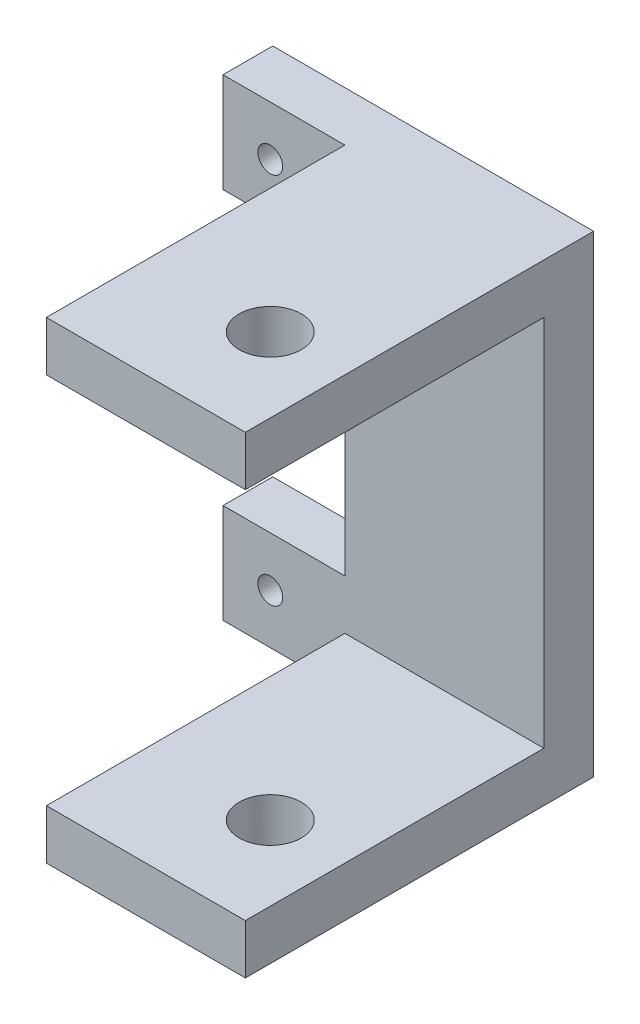
ISO-10303-21;
HEADER;
FILE_DESCRIPTION(('STEP AP214'),'2;1');
FILE_NAME('part.step','',(''),(''),'','','');
FILE_SCHEMA(('AUTOMOTIVE_DESIGN { 1 0 10303 214 1 1 1 1 }'));
ENDSEC;
DATA;
#1=APPLICATION_CONTEXT('core data for automotive mechanical design processes');
#2=APPLICATION_PROTOCOL_DEFINITION('international standard','automotive_design',2000,#1);
#3=PRODUCT_CONTEXT('',#1,'mechanical');
#4=PRODUCT('Part','Part','',(#3));
#5=PRODUCT_RELATED_PRODUCT_CATEGORY('part','',(#4));
#6=PRODUCT_DEFINITION_FORMATION('','',#4);
#7=PRODUCT_DEFINITION_CONTEXT('part definition',#1,'design');
#8=PRODUCT_DEFINITION('design','',#6,#7);
#9=PRODUCT_DEFINITION_SHAPE('','',#8);
#10=(LENGTH_UNIT() NAMED_UNIT(*) SI_UNIT(.MILLI.,.METRE.));
#11=(NAMED_UNIT(*) PLANE_ANGLE_UNIT() SI_UNIT($,.RADIAN.));
#12=(NAMED_UNIT(*) SI_UNIT($,.STERADIAN.) SOLID_ANGLE_UNIT());
#13=UNCERTAINTY_MEASURE_WITH_UNIT(LENGTH_MEASURE(1.E-05),#10,'distance_accuracy_value','');
#14=(GEOMETRIC_REPRESENTATION_CONTEXT(3) GLOBAL_UNCERTAINTY_ASSIGNED_CONTEXT((#13)) GLOBAL_UNIT_ASSIGNED_CONTEXT((#10,
#11,#12)) REPRESENTATION_CONTEXT('',''));
#15=CARTESIAN_POINT('',(0.,0.,0.));
#16=DIRECTION('',(0.,0.,1.));
#17=DIRECTION('',(1.,0.,0.));
#18=AXIS2_PLACEMENT_3D('',#15,#16,#17);
#19=CARTESIAN_POINT('',(0.,0.,2.));
#20=DIRECTION('',(0.,0.,1.));
#21=DIRECTION('',(1.,0.,0.));
#22=AXIS2_PLACEMENT_3D('',#19,#20,#21);
#23=PLANE('',#22);
#24=CARTESIAN_POINT('',(-3.,7.5,2.));
#25=DIRECTION('',(0.,0.,1.));
#26=DIRECTION('',(1.,0.,0.));
#27=AXIS2_PLACEMENT_3D('',#24,#25,#26);
#28=CIRCLE('',#27,0.5);
#29=CARTESIAN_POINT('',(-2.5,7.5,2.));
#30=VERTEX_POINT('',#29);
#31=EDGE_CURVE('E317',#30,#30,#28,.T.);
#32=ORIENTED_EDGE('',*,*,#31,.F.);
#33=EDGE_LOOP('',(#32));
#34=FACE_BOUND('',#33,.T.);
#35=CARTESIAN_POINT('',(-3.,-7.5,2.));
#36=DIRECTION('',(0.,0.,1.));
#37=DIRECTION('',(1.,0.,0.));
#38=AXIS2_PLACEMENT_3D('',#35,#36,#37);
#39=CIRCLE('',#38,0.5);
#40=CARTESIAN_POINT('',(-2.5,-7.5,2.));
#41=VERTEX_POINT('',#40);
#42=EDGE_CURVE('E377',#41,#41,#39,.T.);
#43=ORIENTED_EDGE('',*,*,#42,.F.);
#44=EDGE_LOOP('',(#43));
#45=FACE_BOUND('',#44,.T.);
#46=DIRECTION('',(0.,-1.,0.));
#47=VECTOR('',#46,1.);
#48=CARTESIAN_POINT('',(0.,-7.5,2.));
#49=LINE('',#48,#47);
#50=CARTESIAN_POINT('',(0.,-7.5,2.));
#51=VERTEX_POINT('',#50);
#52=CARTESIAN_POINT('',(0.,-9.5,2.));
#53=VERTEX_POINT('',#52);
#54=EDGE_CURVE('E49',#51,#53,#49,.T.);
#55=ORIENTED_EDGE('',*,*,#54,.F.);
#56=DIRECTION('',(-1.,0.,0.));
#57=VECTOR('',#56,1.);
#58=CARTESIAN_POINT('',(0.,-7.5,2.));
#59=LINE('',#58,#57);
#60=CARTESIAN_POINT('',(8.,-7.5,2.));
#61=VERTEX_POINT('',#60);
#62=EDGE_CURVE('E53',#61,#51,#59,.T.);
#63=ORIENTED_EDGE('',*,*,#62,.F.);
#64=DIRECTION('',(0.,1.,0.));
#65=VECTOR('',#64,1.);
#66=CARTESIAN_POINT('',(8.,9.5,2.));
#67=LINE('',#66,#65);
#68=CARTESIAN_POINT('',(8.,7.5,2.));
#69=VERTEX_POINT('',#68);
#70=EDGE_CURVE('E155',#61,#69,#67,.T.);
#71=ORIENTED_EDGE('',*,*,#70,.T.);
#72=DIRECTION('',(1.,0.,0.));
#73=VECTOR('',#72,1.);
#74=CARTESIAN_POINT('',(0.,7.5,2.));
#75=LINE('',#74,#73);
#76=CARTESIAN_POINT('',(0.,7.5,2.));
#77=VERTEX_POINT('',#76);
#78=EDGE_CURVE('E159',#77,#69,#75,.T.);
#79=ORIENTED_EDGE('',*,*,#78,.F.);
#80=DIRECTION('',(0.,-1.,0.));
#81=VECTOR('',#80,1.);
#82=CARTESIAN_POINT('',(0.,9.5,2.));
#83=LINE('',#82,#81);
#84=CARTESIAN_POINT('',(0.,9.5,2.));
#85=VERTEX_POINT('',#84);
#86=EDGE_CURVE('E156',#85,#77,#83,.T.);
#87=ORIENTED_EDGE('',*,*,#86,.F.);
#88=DIRECTION('',(-1.,0.,0.));
#89=VECTOR('',#88,1.);
#90=CARTESIAN_POINT('',(-4.9,9.5,2.));
#91=LINE('',#90,#89);
#92=CARTESIAN_POINT('',(-4.9,9.5,2.));
#93=VERTEX_POINT('',#92);
#94=EDGE_CURVE('E187',#85,#93,#91,.T.);
#95=ORIENTED_EDGE('',*,*,#94,.T.);
#96=DIRECTION('',(0.,-1.,0.));
#97=VECTOR('',#96,1.);
#98=CARTESIAN_POINT('',(-4.9,9.5,2.));
#99=LINE('',#98,#97);
#100=CARTESIAN_POINT('',(-4.9,5.5,2.));
#101=VERTEX_POINT('',#100);
#102=EDGE_CURVE('E190',#93,#101,#99,.T.);
#103=ORIENTED_EDGE('',*,*,#102,.T.);
#104=DIRECTION('',(1.,0.,0.));
#105=VECTOR('',#104,1.);
#106=CARTESIAN_POINT('',(-4.9,5.5,2.));
#107=LINE('',#106,#105);
#108=CARTESIAN_POINT('',(0.,5.5,2.));
#109=VERTEX_POINT('',#108);
#110=EDGE_CURVE('E192',#101,#109,#107,.T.);
#111=ORIENTED_EDGE('',*,*,#110,.T.);
#112=DIRECTION('',(0.,-1.,0.));
#113=VECTOR('',#112,1.);
#114=CARTESIAN_POINT('',(0.,5.5,2.));
#115=LINE('',#114,#113);
#116=CARTESIAN_POINT('',(0.,-5.5,2.));
#117=VERTEX_POINT('',#116);
#118=EDGE_CURVE('E194',#109,#117,#115,.T.);
#119=ORIENTED_EDGE('',*,*,#118,.T.);
#120=DIRECTION('',(-1.,0.,0.));
#121=VECTOR('',#120,1.);
#122=CARTESIAN_POINT('',(-4.9,-5.5,2.));
#123=LINE('',#122,#121);
#124=CARTESIAN_POINT('',(-4.9,-5.5,2.));
#125=VERTEX_POINT('',#124);
#126=EDGE_CURVE('E196',#117,#125,#123,.T.);
#127=ORIENTED_EDGE('',*,*,#126,.T.);
#128=DIRECTION('',(0.,-1.,0.));
#129=VECTOR('',#128,1.);
#130=CARTESIAN_POINT('',(-4.9,-5.5,2.));
#131=LINE('',#130,#129);
#132=CARTESIAN_POINT('',(-4.89999999999999,-9.5,2.));
#133=VERTEX_POINT('',#132);
#134=EDGE_CURVE('E198',#125,#133,#131,.T.);
#135=ORIENTED_EDGE('',*,*,#134,.T.);
#136=DIRECTION('',(1.,0.,0.));
#137=VECTOR('',#136,1.);
#138=CARTESIAN_POINT('',(-4.89999999999999,-9.5,2.));
#139=LINE('',#138,#137);
#140=EDGE_CURVE('E200',#133,#53,#139,.T.);
#141=ORIENTED_EDGE('',*,*,#140,.T.);
#142=EDGE_LOOP('',(#55,#63,#71,#79,#87,#95,#103,#111,#119,#127,#135,#141));
#143=FACE_BOUND('',#142,.T.);
#144=ADVANCED_FACE('F33',(#34,#45,#143),#23,.T.);
#145=CARTESIAN_POINT('',(8.,9.5,2.));
#146=DIRECTION('',(-1.,0.,0.));
#147=DIRECTION('',(0.,-1.,0.));
#148=AXIS2_PLACEMENT_3D('',#145,#146,#147);
#149=PLANE('',#148);
#150=DIRECTION('',(0.,1.,0.));
#151=VECTOR('',#150,1.);
#152=CARTESIAN_POINT('',(8.,9.5,0.));
#153=LINE('',#152,#151);
#154=CARTESIAN_POINT('',(8.,-9.5,0.));
#155=VERTEX_POINT('',#154);
#156=CARTESIAN_POINT('',(8.,9.5,0.));
#157=VERTEX_POINT('',#156);
#158=EDGE_CURVE('E185',#155,#157,#153,.T.);
#159=ORIENTED_EDGE('',*,*,#158,.T.);
#160=DIRECTION('',(0.,0.,-1.));
#161=VECTOR('',#160,1.);
#162=CARTESIAN_POINT('',(8.,9.5,2.));
#163=LINE('',#162,#161);
#164=CARTESIAN_POINT('',(8.,9.5,14.));
#165=VERTEX_POINT('',#164);
#166=EDGE_CURVE('E11',#165,#157,#163,.T.);
#167=ORIENTED_EDGE('',*,*,#166,.F.);
#168=DIRECTION('',(0.,1.,0.));
#169=VECTOR('',#168,1.);
#170=CARTESIAN_POINT('',(8.,9.5,14.));
#171=LINE('',#170,#169);
#172=CARTESIAN_POINT('',(8.,7.5,14.));
#173=VERTEX_POINT('',#172);
#174=EDGE_CURVE('E170',#173,#165,#171,.T.);
#175=ORIENTED_EDGE('',*,*,#174,.F.);
#176=DIRECTION('',(0.,0.,-1.));
#177=VECTOR('',#176,1.);
#178=CARTESIAN_POINT('',(8.,7.5,14.));
#179=LINE('',#178,#177);
#180=EDGE_CURVE('E180',#173,#69,#179,.T.);
#181=ORIENTED_EDGE('',*,*,#180,.T.);
#182=ORIENTED_EDGE('',*,*,#70,.F.);
#183=DIRECTION('',(0.,0.,-1.));
#184=VECTOR('',#183,1.);
#185=CARTESIAN_POINT('',(8.,-7.5,14.));
#186=LINE('',#185,#184);
#187=CARTESIAN_POINT('',(8.,-7.5,14.));
#188=VERTEX_POINT('',#187);
#189=EDGE_CURVE('E137',#188,#61,#186,.T.);
#190=ORIENTED_EDGE('',*,*,#189,.F.);
#191=DIRECTION('',(0.,1.,0.));
#192=VECTOR('',#191,1.);
#193=CARTESIAN_POINT('',(8.,-7.5,14.));
#194=LINE('',#193,#192);
#195=CARTESIAN_POINT('',(8.,-9.5,14.));
#196=VERTEX_POINT('',#195);
#197=EDGE_CURVE('E143',#196,#188,#194,.T.);
#198=ORIENTED_EDGE('',*,*,#197,.F.);
#199=DIRECTION('',(0.,0.,-1.));
#200=VECTOR('',#199,1.);
#201=CARTESIAN_POINT('',(8.,-9.5,2.));
#202=LINE('',#201,#200);
#203=EDGE_CURVE('E202',#196,#155,#202,.T.);
#204=ORIENTED_EDGE('',*,*,#203,.T.);
#205=EDGE_LOOP('',(#159,#167,#175,#181,#182,#190,#198,#204));
#206=FACE_BOUND('',#205,.T.);
#207=ADVANCED_FACE('F35',(#206),#149,.F.);
#208=CARTESIAN_POINT('',(-4.9,9.5,2.));
#209=DIRECTION('',(0.,-1.,0.));
#210=DIRECTION('',(0.,0.,-1.));
#211=AXIS2_PLACEMENT_3D('',#208,#209,#210);
#212=PLANE('',#211);
#213=CARTESIAN_POINT('',(5.,9.5,10.));
#214=DIRECTION('',(0.,-1.,0.));
#215=DIRECTION('',(0.,0.,-1.));
#216=AXIS2_PLACEMENT_3D('',#213,#214,#215);
#217=CIRCLE('',#216,1.25);
#218=CARTESIAN_POINT('',(5.,9.5,8.75));
#219=VERTEX_POINT('',#218);
#220=EDGE_CURVE('E311',#219,#219,#217,.T.);
#221=ORIENTED_EDGE('',*,*,#220,.T.);
#222=EDGE_LOOP('',(#221));
#223=FACE_BOUND('',#222,.T.);
#224=DIRECTION('',(-1.,0.,0.));
#225=VECTOR('',#224,1.);
#226=CARTESIAN_POINT('',(-4.9,9.5,0.));
#227=LINE('',#226,#225);
#228=CARTESIAN_POINT('',(-4.9,9.5,0.));
#229=VERTEX_POINT('',#228);
#230=EDGE_CURVE('E204',#157,#229,#227,.T.);
#231=ORIENTED_EDGE('',*,*,#230,.T.);
#232=DIRECTION('',(0.,0.,-1.));
#233=VECTOR('',#232,1.);
#234=CARTESIAN_POINT('',(-4.9,9.5,2.));
#235=LINE('',#234,#233);
#236=EDGE_CURVE('E42',#93,#229,#235,.T.);
#237=ORIENTED_EDGE('',*,*,#236,.F.);
#238=ORIENTED_EDGE('',*,*,#94,.F.);
#239=DIRECTION('',(0.,0.,-1.));
#240=VECTOR('',#239,1.);
#241=CARTESIAN_POINT('',(0.,9.5,14.));
#242=LINE('',#241,#240);
#243=CARTESIAN_POINT('',(0.,9.5,14.));
#244=VERTEX_POINT('',#243);
#245=EDGE_CURVE('E174',#244,#85,#242,.T.);
#246=ORIENTED_EDGE('',*,*,#245,.F.);
#247=DIRECTION('',(-1.,0.,0.));
#248=VECTOR('',#247,1.);
#249=CARTESIAN_POINT('',(0.,9.5,14.));
#250=LINE('',#249,#248);
#251=EDGE_CURVE('E173',#165,#244,#250,.T.);
#252=ORIENTED_EDGE('',*,*,#251,.F.);
#253=ORIENTED_EDGE('',*,*,#166,.T.);
#254=EDGE_LOOP('',(#231,#237,#238,#246,#252,#253));
#255=FACE_BOUND('',#254,.T.);
#256=ADVANCED_FACE('F259',(#223,#255),#212,.F.);
#257=CARTESIAN_POINT('',(-4.9,9.5,2.));
#258=DIRECTION('',(1.,0.,0.));
#259=DIRECTION('',(0.,1.,0.));
#260=AXIS2_PLACEMENT_3D('',#257,#258,#259);
#261=PLANE('',#260);
#262=DIRECTION('',(0.,-1.,0.));
#263=VECTOR('',#262,1.);
#264=CARTESIAN_POINT('',(-4.9,9.5,0.));
#265=LINE('',#264,#263);
#266=CARTESIAN_POINT('',(-4.9,5.5,0.));
#267=VERTEX_POINT('',#266);
#268=EDGE_CURVE('E206',#229,#267,#265,.T.);
#269=ORIENTED_EDGE('',*,*,#268,.T.);
#270=DIRECTION('',(0.,0.,-1.));
#271=VECTOR('',#270,1.);
#272=CARTESIAN_POINT('',(-4.9,5.5,2.));
#273=LINE('',#272,#271);
#274=EDGE_CURVE('E230',#101,#267,#273,.T.);
#275=ORIENTED_EDGE('',*,*,#274,.F.);
#276=ORIENTED_EDGE('',*,*,#102,.F.);
#277=ORIENTED_EDGE('',*,*,#236,.T.);
#278=EDGE_LOOP('',(#269,#275,#276,#277));
#279=FACE_BOUND('',#278,.T.);
#280=ADVANCED_FACE('F238',(#279),#261,.F.);
#281=CARTESIAN_POINT('',(-4.9,5.5,2.));
#282=DIRECTION('',(0.,1.,0.));
#283=DIRECTION('',(0.,0.,1.));
#284=AXIS2_PLACEMENT_3D('',#281,#282,#283);
#285=PLANE('',#284);
#286=DIRECTION('',(1.,0.,0.));
#287=VECTOR('',#286,1.);
#288=CARTESIAN_POINT('',(-4.9,5.5,0.));
#289=LINE('',#288,#287);
#290=CARTESIAN_POINT('',(0.,5.5,0.));
#291=VERTEX_POINT('',#290);
#292=EDGE_CURVE('E208',#267,#291,#289,.T.);
#293=ORIENTED_EDGE('',*,*,#292,.T.);
#294=DIRECTION('',(0.,0.,-1.));
#295=VECTOR('',#294,1.);
#296=CARTESIAN_POINT('',(0.,5.5,2.));
#297=LINE('',#296,#295);
#298=EDGE_CURVE('E227',#109,#291,#297,.T.);
#299=ORIENTED_EDGE('',*,*,#298,.F.);
#300=ORIENTED_EDGE('',*,*,#110,.F.);
#301=ORIENTED_EDGE('',*,*,#274,.T.);
#302=EDGE_LOOP('',(#293,#299,#300,#301));
#303=FACE_BOUND('',#302,.T.);
#304=ADVANCED_FACE('F250',(#303),#285,.F.);
#305=CARTESIAN_POINT('',(0.,5.5,2.));
#306=DIRECTION('',(1.,0.,0.));
#307=DIRECTION('',(0.,1.,0.));
#308=AXIS2_PLACEMENT_3D('',#305,#306,#307);
#309=PLANE('',#308);
#310=DIRECTION('',(0.,-1.,0.));
#311=VECTOR('',#310,1.);
#312=CARTESIAN_POINT('',(0.,5.5,0.));
#313=LINE('',#312,#311);
#314=CARTESIAN_POINT('',(0.,-5.5,0.));
#315=VERTEX_POINT('',#314);
#316=EDGE_CURVE('E210',#291,#315,#313,.T.);
#317=ORIENTED_EDGE('',*,*,#316,.T.);
#318=DIRECTION('',(0.,0.,-1.));
#319=VECTOR('',#318,1.);
#320=CARTESIAN_POINT('',(0.,-5.5,2.));
#321=LINE('',#320,#319);
#322=EDGE_CURVE('E224',#117,#315,#321,.T.);
#323=ORIENTED_EDGE('',*,*,#322,.F.);
#324=ORIENTED_EDGE('',*,*,#118,.F.);
#325=ORIENTED_EDGE('',*,*,#298,.T.);
#326=EDGE_LOOP('',(#317,#323,#324,#325));
#327=FACE_BOUND('',#326,.T.);
#328=ADVANCED_FACE('F254',(#327),#309,.F.);
#329=CARTESIAN_POINT('',(-4.9,-5.5,2.));
#330=DIRECTION('',(0.,-1.,0.));
#331=DIRECTION('',(0.,0.,-1.));
#332=AXIS2_PLACEMENT_3D('',#329,#330,#331);
#333=PLANE('',#332);
#334=DIRECTION('',(-1.,0.,0.));
#335=VECTOR('',#334,1.);
#336=CARTESIAN_POINT('',(-4.9,-5.5,0.));
#337=LINE('',#336,#335);
#338=CARTESIAN_POINT('',(-4.9,-5.5,0.));
#339=VERTEX_POINT('',#338);
#340=EDGE_CURVE('E212',#315,#339,#337,.T.);
#341=ORIENTED_EDGE('',*,*,#340,.T.);
#342=DIRECTION('',(0.,0.,-1.));
#343=VECTOR('',#342,1.);
#344=CARTESIAN_POINT('',(-4.9,-5.5,2.));
#345=LINE('',#344,#343);
#346=EDGE_CURVE('E221',#125,#339,#345,.T.);
#347=ORIENTED_EDGE('',*,*,#346,.F.);
#348=ORIENTED_EDGE('',*,*,#126,.F.);
#349=ORIENTED_EDGE('',*,*,#322,.T.);
#350=EDGE_LOOP('',(#341,#347,#348,#349));
#351=FACE_BOUND('',#350,.T.);
#352=ADVANCED_FACE('F280',(#351),#333,.F.);
#353=CARTESIAN_POINT('',(-4.9,-5.5,2.));
#354=DIRECTION('',(1.,0.,0.));
#355=DIRECTION('',(0.,1.,0.));
#356=AXIS2_PLACEMENT_3D('',#353,#354,#355);
#357=PLANE('',#356);
#358=DIRECTION('',(0.,-1.,0.));
#359=VECTOR('',#358,1.);
#360=CARTESIAN_POINT('',(-4.9,-5.5,0.));
#361=LINE('',#360,#359);
#362=CARTESIAN_POINT('',(-4.89999999999999,-9.5,0.));
#363=VERTEX_POINT('',#362);
#364=EDGE_CURVE('E214',#339,#363,#361,.T.);
#365=ORIENTED_EDGE('',*,*,#364,.T.);
#366=DIRECTION('',(0.,0.,-1.));
#367=VECTOR('',#366,1.);
#368=CARTESIAN_POINT('',(-4.89999999999999,-9.5,2.));
#369=LINE('',#368,#367);
#370=EDGE_CURVE('E218',#133,#363,#369,.T.);
#371=ORIENTED_EDGE('',*,*,#370,.F.);
#372=ORIENTED_EDGE('',*,*,#134,.F.);
#373=ORIENTED_EDGE('',*,*,#346,.T.);
#374=EDGE_LOOP('',(#365,#371,#372,#373));
#375=FACE_BOUND('',#374,.T.);
#376=ADVANCED_FACE('F278',(#375),#357,.F.);
#377=CARTESIAN_POINT('',(-4.89999999999999,-9.5,2.));
#378=DIRECTION('',(0.,1.,0.));
#379=DIRECTION('',(0.,0.,1.));
#380=AXIS2_PLACEMENT_3D('',#377,#378,#379);
#381=PLANE('',#380);
#382=CARTESIAN_POINT('',(5.,-9.5,10.));
#383=DIRECTION('',(0.,-1.,0.));
#384=DIRECTION('',(0.,0.,-1.));
#385=AXIS2_PLACEMENT_3D('',#382,#383,#384);
#386=CIRCLE('',#385,1.25);
#387=CARTESIAN_POINT('',(5.,-9.5,8.75));
#388=VERTEX_POINT('',#387);
#389=EDGE_CURVE('E309',#388,#388,#386,.T.);
#390=ORIENTED_EDGE('',*,*,#389,.F.);
#391=EDGE_LOOP('',(#390));
#392=FACE_BOUND('',#391,.T.);
#393=DIRECTION('',(1.,0.,0.));
#394=VECTOR('',#393,1.);
#395=CARTESIAN_POINT('',(-4.89999999999999,-9.5,0.));
#396=LINE('',#395,#394);
#397=EDGE_CURVE('E188',#363,#155,#396,.T.);
#398=ORIENTED_EDGE('',*,*,#397,.T.);
#399=ORIENTED_EDGE('',*,*,#203,.F.);
#400=DIRECTION('',(1.,0.,0.));
#401=VECTOR('',#400,1.);
#402=CARTESIAN_POINT('',(0.,-9.5,14.));
#403=LINE('',#402,#401);
#404=CARTESIAN_POINT('',(0.,-9.5,14.));
#405=VERTEX_POINT('',#404);
#406=EDGE_CURVE('E149',#405,#196,#403,.T.);
#407=ORIENTED_EDGE('',*,*,#406,.F.);
#408=DIRECTION('',(0.,0.,-1.));
#409=VECTOR('',#408,1.);
#410=CARTESIAN_POINT('',(0.,-9.5,14.));
#411=LINE('',#410,#409);
#412=EDGE_CURVE('E161',#405,#53,#411,.T.);
#413=ORIENTED_EDGE('',*,*,#412,.T.);
#414=ORIENTED_EDGE('',*,*,#140,.F.);
#415=ORIENTED_EDGE('',*,*,#370,.T.);
#416=EDGE_LOOP('',(#398,#399,#407,#413,#414,#415));
#417=FACE_BOUND('',#416,.T.);
#418=ADVANCED_FACE('F272',(#392,#417),#381,.F.);
#419=CARTESIAN_POINT('',(0.,0.,0.));
#420=DIRECTION('',(0.,0.,1.));
#421=DIRECTION('',(1.,0.,0.));
#422=AXIS2_PLACEMENT_3D('',#419,#420,#421);
#423=PLANE('',#422);
#424=CARTESIAN_POINT('',(-3.,7.5,0.));
#425=DIRECTION('',(0.,0.,1.));
#426=DIRECTION('',(1.,0.,0.));
#427=AXIS2_PLACEMENT_3D('',#424,#425,#426);
#428=CIRCLE('',#427,0.5);
#429=CARTESIAN_POINT('',(-2.5,7.5,0.));
#430=VERTEX_POINT('',#429);
#431=EDGE_CURVE('E312',#430,#430,#428,.F.);
#432=ORIENTED_EDGE('',*,*,#431,.F.);
#433=EDGE_LOOP('',(#432));
#434=FACE_BOUND('',#433,.T.);
#435=CARTESIAN_POINT('',(-3.,-7.5,0.));
#436=DIRECTION('',(0.,0.,1.));
#437=DIRECTION('',(1.,0.,0.));
#438=AXIS2_PLACEMENT_3D('',#435,#436,#437);
#439=CIRCLE('',#438,0.5);
#440=CARTESIAN_POINT('',(-2.5,-7.5,0.));
#441=VERTEX_POINT('',#440);
#442=EDGE_CURVE('E375',#441,#441,#439,.F.);
#443=ORIENTED_EDGE('',*,*,#442,.F.);
#444=EDGE_LOOP('',(#443));
#445=FACE_BOUND('',#444,.T.);
#446=ORIENTED_EDGE('',*,*,#158,.F.);
#447=ORIENTED_EDGE('',*,*,#397,.F.);
#448=ORIENTED_EDGE('',*,*,#364,.F.);
#449=ORIENTED_EDGE('',*,*,#340,.F.);
#450=ORIENTED_EDGE('',*,*,#316,.F.);
#451=ORIENTED_EDGE('',*,*,#292,.F.);
#452=ORIENTED_EDGE('',*,*,#268,.F.);
#453=ORIENTED_EDGE('',*,*,#230,.F.);
#454=EDGE_LOOP('',(#446,#447,#448,#449,#450,#451,#452,#453));
#455=FACE_BOUND('',#454,.T.);
#456=ADVANCED_FACE('F245',(#434,#445,#455),#423,.F.);
#457=CARTESIAN_POINT('',(0.,9.5,14.));
#458=DIRECTION('',(1.,0.,0.));
#459=DIRECTION('',(0.,1.,0.));
#460=AXIS2_PLACEMENT_3D('',#457,#458,#459);
#461=PLANE('',#460);
#462=ORIENTED_EDGE('',*,*,#86,.T.);
#463=DIRECTION('',(0.,0.,-1.));
#464=VECTOR('',#463,1.);
#465=CARTESIAN_POINT('',(0.,7.5,14.));
#466=LINE('',#465,#464);
#467=CARTESIAN_POINT('',(0.,7.5,14.));
#468=VERTEX_POINT('',#467);
#469=EDGE_CURVE('E182',#468,#77,#466,.T.);
#470=ORIENTED_EDGE('',*,*,#469,.F.);
#471=DIRECTION('',(0.,-1.,0.));
#472=VECTOR('',#471,1.);
#473=CARTESIAN_POINT('',(0.,9.5,14.));
#474=LINE('',#473,#472);
#475=EDGE_CURVE('E165',#244,#468,#474,.T.);
#476=ORIENTED_EDGE('',*,*,#475,.F.);
#477=ORIENTED_EDGE('',*,*,#245,.T.);
#478=EDGE_LOOP('',(#462,#470,#476,#477));
#479=FACE_BOUND('',#478,.T.);
#480=ADVANCED_FACE('F263',(#479),#461,.F.);
#481=CARTESIAN_POINT('',(0.,7.5,14.));
#482=DIRECTION('',(0.,1.,0.));
#483=DIRECTION('',(-1.,0.,0.));
#484=AXIS2_PLACEMENT_3D('',#481,#482,#483);
#485=PLANE('',#484);
#486=CARTESIAN_POINT('',(5.,7.5,10.));
#487=DIRECTION('',(0.,1.,0.));
#488=DIRECTION('',(-1.,0.,0.));
#489=AXIS2_PLACEMENT_3D('',#486,#487,#488);
#490=CIRCLE('',#489,1.25);
#491=CARTESIAN_POINT('',(3.75,7.5,10.));
#492=VERTEX_POINT('',#491);
#493=EDGE_CURVE('E321',#492,#492,#490,.T.);
#494=ORIENTED_EDGE('',*,*,#493,.T.);
#495=EDGE_LOOP('',(#494));
#496=FACE_BOUND('',#495,.T.);
#497=ORIENTED_EDGE('',*,*,#78,.T.);
#498=ORIENTED_EDGE('',*,*,#180,.F.);
#499=DIRECTION('',(1.,0.,0.));
#500=VECTOR('',#499,1.);
#501=CARTESIAN_POINT('',(0.,7.5,14.));
#502=LINE('',#501,#500);
#503=EDGE_CURVE('E168',#468,#173,#502,.T.);
#504=ORIENTED_EDGE('',*,*,#503,.F.);
#505=ORIENTED_EDGE('',*,*,#469,.T.);
#506=EDGE_LOOP('',(#497,#498,#504,#505));
#507=FACE_BOUND('',#506,.T.);
#508=ADVANCED_FACE('F343',(#496,#507),#485,.F.);
#509=CARTESIAN_POINT('',(0.,0.,14.));
#510=DIRECTION('',(0.,0.,1.));
#511=DIRECTION('',(1.,0.,0.));
#512=AXIS2_PLACEMENT_3D('',#509,#510,#511);
#513=PLANE('',#512);
#514=ORIENTED_EDGE('',*,*,#475,.T.);
#515=ORIENTED_EDGE('',*,*,#503,.T.);
#516=ORIENTED_EDGE('',*,*,#174,.T.);
#517=ORIENTED_EDGE('',*,*,#251,.T.);
#518=EDGE_LOOP('',(#514,#515,#516,#517));
#519=FACE_BOUND('',#518,.T.);
#520=ADVANCED_FACE('F266',(#519),#513,.T.);
#521=CARTESIAN_POINT('',(0.,-7.5,14.));
#522=DIRECTION('',(0.,-1.,0.));
#523=DIRECTION('',(1.,0.,0.));
#524=AXIS2_PLACEMENT_3D('',#521,#522,#523);
#525=PLANE('',#524);
#526=CARTESIAN_POINT('',(5.,-7.5,10.));
#527=DIRECTION('',(0.,-1.,0.));
#528=DIRECTION('',(1.,0.,0.));
#529=AXIS2_PLACEMENT_3D('',#526,#527,#528);
#530=CIRCLE('',#529,1.25);
#531=CARTESIAN_POINT('',(6.25,-7.5,10.));
#532=VERTEX_POINT('',#531);
#533=EDGE_CURVE('E37',#532,#532,#530,.T.);
#534=ORIENTED_EDGE('',*,*,#533,.T.);
#535=EDGE_LOOP('',(#534));
#536=FACE_BOUND('',#535,.T.);
#537=ORIENTED_EDGE('',*,*,#62,.T.);
#538=DIRECTION('',(0.,0.,-1.));
#539=VECTOR('',#538,1.);
#540=CARTESIAN_POINT('',(0.,-7.5,14.));
#541=LINE('',#540,#539);
#542=CARTESIAN_POINT('',(0.,-7.5,14.));
#543=VERTEX_POINT('',#542);
#544=EDGE_CURVE('E139',#543,#51,#541,.T.);
#545=ORIENTED_EDGE('',*,*,#544,.F.);
#546=DIRECTION('',(-1.,0.,0.));
#547=VECTOR('',#546,1.);
#548=CARTESIAN_POINT('',(0.,-7.5,14.));
#549=LINE('',#548,#547);
#550=EDGE_CURVE('E133',#188,#543,#549,.T.);
#551=ORIENTED_EDGE('',*,*,#550,.F.);
#552=ORIENTED_EDGE('',*,*,#189,.T.);
#553=EDGE_LOOP('',(#537,#545,#551,#552));
#554=FACE_BOUND('',#553,.T.);
#555=ADVANCED_FACE('F135',(#536,#554),#525,.F.);
#556=CARTESIAN_POINT('',(0.,-7.5,14.));
#557=DIRECTION('',(1.,0.,0.));
#558=DIRECTION('',(0.,1.,0.));
#559=AXIS2_PLACEMENT_3D('',#556,#557,#558);
#560=PLANE('',#559);
#561=ORIENTED_EDGE('',*,*,#54,.T.);
#562=ORIENTED_EDGE('',*,*,#412,.F.);
#563=DIRECTION('',(0.,-1.,0.));
#564=VECTOR('',#563,1.);
#565=CARTESIAN_POINT('',(0.,-7.5,14.));
#566=LINE('',#565,#564);
#567=EDGE_CURVE('E142',#543,#405,#566,.T.);
#568=ORIENTED_EDGE('',*,*,#567,.F.);
#569=ORIENTED_EDGE('',*,*,#544,.T.);
#570=EDGE_LOOP('',(#561,#562,#568,#569));
#571=FACE_BOUND('',#570,.T.);
#572=ADVANCED_FACE('F329',(#571),#560,.F.);
#573=CARTESIAN_POINT('',(0.,0.,14.));
#574=DIRECTION('',(0.,0.,1.));
#575=DIRECTION('',(1.,0.,0.));
#576=AXIS2_PLACEMENT_3D('',#573,#574,#575);
#577=PLANE('',#576);
#578=ORIENTED_EDGE('',*,*,#197,.T.);
#579=ORIENTED_EDGE('',*,*,#550,.T.);
#580=ORIENTED_EDGE('',*,*,#567,.T.);
#581=ORIENTED_EDGE('',*,*,#406,.T.);
#582=EDGE_LOOP('',(#578,#579,#580,#581));
#583=FACE_BOUND('',#582,.T.);
#584=ADVANCED_FACE('F147',(#583),#577,.T.);
#585=CARTESIAN_POINT('',(5.,9.5,10.));
#586=DIRECTION('',(0.,-1.,0.));
#587=DIRECTION('',(0.,0.,-1.));
#588=AXIS2_PLACEMENT_3D('',#585,#586,#587);
#589=CYLINDRICAL_SURFACE('',#588,1.25);
#590=ORIENTED_EDGE('',*,*,#389,.T.);
#591=EDGE_LOOP('',(#590));
#592=FACE_BOUND('',#591,.T.);
#593=ORIENTED_EDGE('',*,*,#533,.F.);
#594=EDGE_LOOP('',(#593));
#595=FACE_BOUND('',#594,.T.);
#596=ADVANCED_FACE('F336',(#592,#595),#589,.F.);
#597=ORIENTED_EDGE('',*,*,#220,.F.);
#598=EDGE_LOOP('',(#597));
#599=FACE_BOUND('',#598,.T.);
#600=ORIENTED_EDGE('',*,*,#493,.F.);
#601=EDGE_LOOP('',(#600));
#602=FACE_BOUND('',#601,.T.);
#603=ADVANCED_FACE('F352',(#599,#602),#589,.F.);
#604=CARTESIAN_POINT('',(-3.,-7.5,-0.00100000000000013));
#605=DIRECTION('',(0.,0.,1.));
#606=DIRECTION('',(1.,0.,0.));
#607=AXIS2_PLACEMENT_3D('',#604,#605,#606);
#608=CYLINDRICAL_SURFACE('',#607,0.5);
#609=ORIENTED_EDGE('',*,*,#42,.T.);
#610=EDGE_LOOP('',(#609));
#611=FACE_BOUND('',#610,.T.);
#612=ORIENTED_EDGE('',*,*,#442,.T.);
#613=EDGE_LOOP('',(#612));
#614=FACE_BOUND('',#613,.T.);
#615=ADVANCED_FACE('F354',(#611,#614),#608,.F.);
#616=CARTESIAN_POINT('',(-3.,7.5,-0.00100000000000013));
#617=DIRECTION('',(0.,0.,1.));
#618=DIRECTION('',(1.,0.,0.));
#619=AXIS2_PLACEMENT_3D('',#616,#617,#618);
#620=CYLINDRICAL_SURFACE('',#619,0.5);
#621=ORIENTED_EDGE('',*,*,#31,.T.);
#622=EDGE_LOOP('',(#621));
#623=FACE_BOUND('',#622,.T.);
#624=ORIENTED_EDGE('',*,*,#431,.T.);
#625=EDGE_LOOP('',(#624));
#626=FACE_BOUND('',#625,.T.);
#627=ADVANCED_FACE('F360',(#623,#626),#620,.F.);
#628=CLOSED_SHELL('',(#144,#207,#256,#280,#304,#328,#352,#376,#418,#456,#480,#508,#520,#555,
#572,#584,#596,#603,#615,#627));
#629=MANIFOLD_SOLID_BREP('B2',#628);
#630=ADVANCED_BREP_SHAPE_REPRESENTATION('',(#18,#629),#14);
#631=SHAPE_DEFINITION_REPRESENTATION(#9,#630);
ENDSEC;
END-ISO-10303-21;
